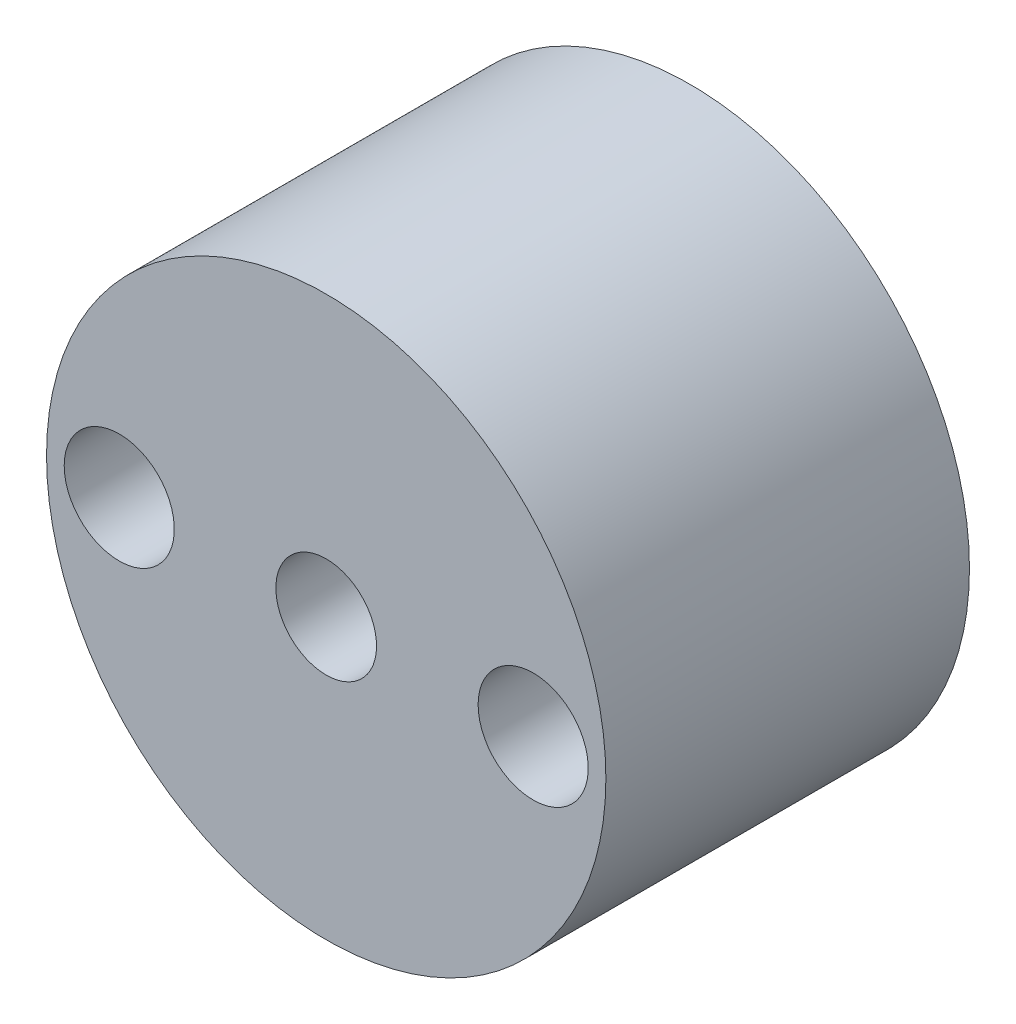
ISO-10303-21;
HEADER;
FILE_DESCRIPTION(('STEP AP214'),'2;1');
FILE_NAME('part.step','',(''),(''),'','','');
FILE_SCHEMA(('AUTOMOTIVE_DESIGN { 1 0 10303 214 1 1 1 1 }'));
ENDSEC;
DATA;
#1=APPLICATION_CONTEXT('core data for automotive mechanical design processes');
#2=APPLICATION_PROTOCOL_DEFINITION('international standard','automotive_design',2000,#1);
#3=PRODUCT_CONTEXT('',#1,'mechanical');
#4=PRODUCT('Part','Part','',(#3));
#5=PRODUCT_RELATED_PRODUCT_CATEGORY('part','',(#4));
#6=PRODUCT_DEFINITION_FORMATION('','',#4);
#7=PRODUCT_DEFINITION_CONTEXT('part definition',#1,'design');
#8=PRODUCT_DEFINITION('design','',#6,#7);
#9=PRODUCT_DEFINITION_SHAPE('','',#8);
#10=(LENGTH_UNIT() NAMED_UNIT(*) SI_UNIT(.MILLI.,.METRE.));
#11=(NAMED_UNIT(*) PLANE_ANGLE_UNIT() SI_UNIT($,.RADIAN.));
#12=(NAMED_UNIT(*) SI_UNIT($,.STERADIAN.) SOLID_ANGLE_UNIT());
#13=UNCERTAINTY_MEASURE_WITH_UNIT(LENGTH_MEASURE(1.E-05),#10,'distance_accuracy_value','');
#14=(GEOMETRIC_REPRESENTATION_CONTEXT(3) GLOBAL_UNCERTAINTY_ASSIGNED_CONTEXT((#13)) GLOBAL_UNIT_ASSIGNED_CONTEXT((#10,
#11,#12)) REPRESENTATION_CONTEXT('',''));
#15=CARTESIAN_POINT('',(0.,0.,0.));
#16=DIRECTION('',(0.,0.,1.));
#17=DIRECTION('',(1.,0.,0.));
#18=AXIS2_PLACEMENT_3D('',#15,#16,#17);
#19=CARTESIAN_POINT('',(0.,0.,0.));
#20=DIRECTION('',(0.,0.,1.));
#21=DIRECTION('',(1.,0.,0.));
#22=AXIS2_PLACEMENT_3D('',#19,#20,#21);
#23=PLANE('',#22);
#24=CARTESIAN_POINT('',(4.699,0.,0.));
#25=DIRECTION('',(0.,0.,-1.));
#26=DIRECTION('',(-1.,0.,0.));
#27=AXIS2_PLACEMENT_3D('',#24,#25,#26);
#28=CIRCLE('',#27,1.25);
#29=CARTESIAN_POINT('',(3.449,0.,0.));
#30=VERTEX_POINT('',#29);
#31=EDGE_CURVE('E132',#30,#30,#28,.T.);
#32=ORIENTED_EDGE('',*,*,#31,.F.);
#33=EDGE_LOOP('',(#32));
#34=FACE_BOUND('',#33,.T.);
#35=CARTESIAN_POINT('',(-4.699,0.,0.));
#36=DIRECTION('',(0.,0.,-1.));
#37=DIRECTION('',(-1.,0.,0.));
#38=AXIS2_PLACEMENT_3D('',#35,#36,#37);
#39=CIRCLE('',#38,1.25);
#40=CARTESIAN_POINT('',(-5.949,0.,0.));
#41=VERTEX_POINT('',#40);
#42=EDGE_CURVE('E126',#41,#41,#39,.T.);
#43=ORIENTED_EDGE('',*,*,#42,.F.);
#44=EDGE_LOOP('',(#43));
#45=FACE_BOUND('',#44,.T.);
#46=CARTESIAN_POINT('',(0.,0.,0.));
#47=DIRECTION('',(0.,0.,1.));
#48=DIRECTION('',(1.,0.,0.));
#49=AXIS2_PLACEMENT_3D('',#46,#47,#48);
#50=CIRCLE('',#49,6.35);
#51=CARTESIAN_POINT('',(6.35,0.,0.));
#52=VERTEX_POINT('',#51);
#53=EDGE_CURVE('E11',#52,#52,#50,.T.);
#54=ORIENTED_EDGE('',*,*,#53,.F.);
#55=EDGE_LOOP('',(#54));
#56=FACE_BOUND('',#55,.T.);
#57=CARTESIAN_POINT('',(0.,0.,0.));
#58=DIRECTION('',(0.,0.,1.));
#59=DIRECTION('',(-1.,0.,0.));
#60=AXIS2_PLACEMENT_3D('',#57,#58,#59);
#61=CIRCLE('',#60,3.50345101292997);
#62=CARTESIAN_POINT('',(2.413,2.54,0.));
#63=VERTEX_POINT('',#62);
#64=CARTESIAN_POINT('',(-2.413,2.54,0.));
#65=VERTEX_POINT('',#64);
#66=EDGE_CURVE('E48',#63,#65,#61,.T.);
#67=ORIENTED_EDGE('',*,*,#66,.T.);
#68=DIRECTION('',(0.,-1.,0.));
#69=VECTOR('',#68,1.);
#70=CARTESIAN_POINT('',(-2.413,-2.54,0.));
#71=LINE('',#70,#69);
#72=CARTESIAN_POINT('',(-2.413,-2.54,0.));
#73=VERTEX_POINT('',#72);
#74=EDGE_CURVE('E77',#65,#73,#71,.T.);
#75=ORIENTED_EDGE('',*,*,#74,.T.);
#76=CARTESIAN_POINT('',(0.,0.,0.));
#77=DIRECTION('',(0.,0.,1.));
#78=DIRECTION('',(1.,0.,0.));
#79=AXIS2_PLACEMENT_3D('',#76,#77,#78);
#80=CIRCLE('',#79,3.50345101292997);
#81=CARTESIAN_POINT('',(2.413,-2.54,0.));
#82=VERTEX_POINT('',#81);
#83=EDGE_CURVE('E85',#73,#82,#80,.T.);
#84=ORIENTED_EDGE('',*,*,#83,.T.);
#85=DIRECTION('',(0.,1.,0.));
#86=VECTOR('',#85,1.);
#87=CARTESIAN_POINT('',(2.413,-2.54,0.));
#88=LINE('',#87,#86);
#89=EDGE_CURVE('E91',#82,#63,#88,.T.);
#90=ORIENTED_EDGE('',*,*,#89,.T.);
#91=EDGE_LOOP('',(#67,#75,#84,#90));
#92=FACE_BOUND('',#91,.T.);
#93=ADVANCED_FACE('F33',(#34,#45,#56,#92),#23,.F.);
#94=CARTESIAN_POINT('',(0.,0.,5.08));
#95=DIRECTION('',(0.,0.,-1.));
#96=DIRECTION('',(-1.,0.,0.));
#97=AXIS2_PLACEMENT_3D('',#94,#95,#96);
#98=CYLINDRICAL_SURFACE('',#97,6.35);
#99=ORIENTED_EDGE('',*,*,#53,.T.);
#100=EDGE_LOOP('',(#99));
#101=FACE_BOUND('',#100,.T.);
#102=CARTESIAN_POINT('',(0.,0.,8.255));
#103=DIRECTION('',(0.,0.,1.));
#104=DIRECTION('',(1.,0.,0.));
#105=AXIS2_PLACEMENT_3D('',#102,#103,#104);
#106=CIRCLE('',#105,6.35);
#107=CARTESIAN_POINT('',(6.35,0.,8.255));
#108=VERTEX_POINT('',#107);
#109=EDGE_CURVE('E94',#108,#108,#106,.T.);
#110=ORIENTED_EDGE('',*,*,#109,.F.);
#111=EDGE_LOOP('',(#110));
#112=FACE_BOUND('',#111,.T.);
#113=ADVANCED_FACE('F35',(#101,#112),#98,.T.);
#114=CARTESIAN_POINT('',(0.,0.,5.08));
#115=DIRECTION('',(0.,0.,-1.));
#116=DIRECTION('',(-1.,0.,0.));
#117=AXIS2_PLACEMENT_3D('',#114,#115,#116);
#118=CYLINDRICAL_SURFACE('',#117,3.50345101292997);
#119=ORIENTED_EDGE('',*,*,#66,.F.);
#120=DIRECTION('',(0.,0.,-1.));
#121=VECTOR('',#120,1.);
#122=CARTESIAN_POINT('',(2.413,2.54,5.08));
#123=LINE('',#122,#121);
#124=CARTESIAN_POINT('',(2.413,2.54,5.08));
#125=VERTEX_POINT('',#124);
#126=EDGE_CURVE('E99',#125,#63,#123,.T.);
#127=ORIENTED_EDGE('',*,*,#126,.F.);
#128=CARTESIAN_POINT('',(0.,0.,5.08));
#129=DIRECTION('',(0.,0.,1.));
#130=DIRECTION('',(-1.,0.,0.));
#131=AXIS2_PLACEMENT_3D('',#128,#129,#130);
#132=CIRCLE('',#131,3.50345101292997);
#133=CARTESIAN_POINT('',(-2.413,2.54,5.08));
#134=VERTEX_POINT('',#133);
#135=EDGE_CURVE('E57',#125,#134,#132,.T.);
#136=ORIENTED_EDGE('',*,*,#135,.T.);
#137=DIRECTION('',(0.,0.,-1.));
#138=VECTOR('',#137,1.);
#139=CARTESIAN_POINT('',(-2.413,2.54,5.08));
#140=LINE('',#139,#138);
#141=EDGE_CURVE('E41',#134,#65,#140,.T.);
#142=ORIENTED_EDGE('',*,*,#141,.T.);
#143=EDGE_LOOP('',(#119,#127,#136,#142));
#144=FACE_BOUND('',#143,.T.);
#145=ADVANCED_FACE('F102',(#144),#118,.F.);
#146=CARTESIAN_POINT('',(-2.413,-2.54,5.08));
#147=DIRECTION('',(1.,0.,0.));
#148=DIRECTION('',(0.,1.,0.));
#149=AXIS2_PLACEMENT_3D('',#146,#147,#148);
#150=PLANE('',#149);
#151=ORIENTED_EDGE('',*,*,#74,.F.);
#152=ORIENTED_EDGE('',*,*,#141,.F.);
#153=DIRECTION('',(0.,-1.,0.));
#154=VECTOR('',#153,1.);
#155=CARTESIAN_POINT('',(-2.413,-2.54,5.08));
#156=LINE('',#155,#154);
#157=CARTESIAN_POINT('',(-2.413,-2.54,5.08));
#158=VERTEX_POINT('',#157);
#159=EDGE_CURVE('E79',#134,#158,#156,.T.);
#160=ORIENTED_EDGE('',*,*,#159,.T.);
#161=DIRECTION('',(0.,0.,-1.));
#162=VECTOR('',#161,1.);
#163=CARTESIAN_POINT('',(-2.413,-2.54,5.08));
#164=LINE('',#163,#162);
#165=EDGE_CURVE('E72',#158,#73,#164,.T.);
#166=ORIENTED_EDGE('',*,*,#165,.T.);
#167=EDGE_LOOP('',(#151,#152,#160,#166));
#168=FACE_BOUND('',#167,.T.);
#169=ADVANCED_FACE('F74',(#168),#150,.T.);
#170=CARTESIAN_POINT('',(0.,0.,5.08));
#171=DIRECTION('',(0.,0.,-1.));
#172=DIRECTION('',(-1.,0.,0.));
#173=AXIS2_PLACEMENT_3D('',#170,#171,#172);
#174=CYLINDRICAL_SURFACE('',#173,3.50345101292997);
#175=ORIENTED_EDGE('',*,*,#83,.F.);
#176=ORIENTED_EDGE('',*,*,#165,.F.);
#177=CARTESIAN_POINT('',(0.,0.,5.08));
#178=DIRECTION('',(0.,0.,1.));
#179=DIRECTION('',(1.,0.,0.));
#180=AXIS2_PLACEMENT_3D('',#177,#178,#179);
#181=CIRCLE('',#180,3.50345101292997);
#182=CARTESIAN_POINT('',(2.413,-2.54,5.08));
#183=VERTEX_POINT('',#182);
#184=EDGE_CURVE('E105',#158,#183,#181,.T.);
#185=ORIENTED_EDGE('',*,*,#184,.T.);
#186=DIRECTION('',(0.,0.,-1.));
#187=VECTOR('',#186,1.);
#188=CARTESIAN_POINT('',(2.413,-2.54,5.08));
#189=LINE('',#188,#187);
#190=EDGE_CURVE('E82',#183,#82,#189,.T.);
#191=ORIENTED_EDGE('',*,*,#190,.T.);
#192=EDGE_LOOP('',(#175,#176,#185,#191));
#193=FACE_BOUND('',#192,.T.);
#194=ADVANCED_FACE('F86',(#193),#174,.F.);
#195=CARTESIAN_POINT('',(2.413,-2.54,5.08));
#196=DIRECTION('',(-1.,0.,0.));
#197=DIRECTION('',(0.,-1.,0.));
#198=AXIS2_PLACEMENT_3D('',#195,#196,#197);
#199=PLANE('',#198);
#200=ORIENTED_EDGE('',*,*,#89,.F.);
#201=ORIENTED_EDGE('',*,*,#190,.F.);
#202=DIRECTION('',(0.,1.,0.));
#203=VECTOR('',#202,1.);
#204=CARTESIAN_POINT('',(2.413,-2.54,5.08));
#205=LINE('',#204,#203);
#206=EDGE_CURVE('E101',#183,#125,#205,.T.);
#207=ORIENTED_EDGE('',*,*,#206,.T.);
#208=ORIENTED_EDGE('',*,*,#126,.T.);
#209=EDGE_LOOP('',(#200,#201,#207,#208));
#210=FACE_BOUND('',#209,.T.);
#211=ADVANCED_FACE('F110',(#210),#199,.T.);
#212=CARTESIAN_POINT('',(0.,0.,8.255));
#213=DIRECTION('',(0.,0.,1.));
#214=DIRECTION('',(1.,0.,0.));
#215=AXIS2_PLACEMENT_3D('',#212,#213,#214);
#216=PLANE('',#215);
#217=CARTESIAN_POINT('',(4.699,0.,8.255));
#218=DIRECTION('',(0.,0.,-1.));
#219=DIRECTION('',(-1.,0.,0.));
#220=AXIS2_PLACEMENT_3D('',#217,#218,#219);
#221=CIRCLE('',#220,1.25);
#222=CARTESIAN_POINT('',(3.449,0.,8.255));
#223=VERTEX_POINT('',#222);
#224=EDGE_CURVE('E129',#223,#223,#221,.T.);
#225=ORIENTED_EDGE('',*,*,#224,.T.);
#226=EDGE_LOOP('',(#225));
#227=FACE_BOUND('',#226,.T.);
#228=CARTESIAN_POINT('',(-4.699,0.,8.255));
#229=DIRECTION('',(0.,0.,-1.));
#230=DIRECTION('',(-1.,0.,0.));
#231=AXIS2_PLACEMENT_3D('',#228,#229,#230);
#232=CIRCLE('',#231,1.25);
#233=CARTESIAN_POINT('',(-5.949,0.,8.255));
#234=VERTEX_POINT('',#233);
#235=EDGE_CURVE('E121',#234,#234,#232,.T.);
#236=ORIENTED_EDGE('',*,*,#235,.T.);
#237=EDGE_LOOP('',(#236));
#238=FACE_BOUND('',#237,.T.);
#239=ORIENTED_EDGE('',*,*,#109,.T.);
#240=EDGE_LOOP('',(#239));
#241=FACE_BOUND('',#240,.T.);
#242=CARTESIAN_POINT('',(0.,0.,8.255));
#243=DIRECTION('',(0.,0.,1.));
#244=DIRECTION('',(1.,0.,0.));
#245=AXIS2_PLACEMENT_3D('',#242,#243,#244);
#246=CIRCLE('',#245,1.143);
#247=CARTESIAN_POINT('',(1.143,0.,8.255));
#248=VERTEX_POINT('',#247);
#249=EDGE_CURVE('E117',#248,#248,#246,.T.);
#250=ORIENTED_EDGE('',*,*,#249,.F.);
#251=EDGE_LOOP('',(#250));
#252=FACE_BOUND('',#251,.T.);
#253=ADVANCED_FACE('F148',(#227,#238,#241,#252),#216,.T.);
#254=CARTESIAN_POINT('',(0.,0.,5.08));
#255=DIRECTION('',(0.,0.,1.));
#256=DIRECTION('',(1.,0.,0.));
#257=AXIS2_PLACEMENT_3D('',#254,#255,#256);
#258=PLANE('',#257);
#259=ORIENTED_EDGE('',*,*,#135,.F.);
#260=ORIENTED_EDGE('',*,*,#206,.F.);
#261=ORIENTED_EDGE('',*,*,#184,.F.);
#262=ORIENTED_EDGE('',*,*,#159,.F.);
#263=EDGE_LOOP('',(#259,#260,#261,#262));
#264=FACE_BOUND('',#263,.T.);
#265=CARTESIAN_POINT('',(0.,0.,5.08));
#266=DIRECTION('',(0.,0.,1.));
#267=DIRECTION('',(1.,0.,0.));
#268=AXIS2_PLACEMENT_3D('',#265,#266,#267);
#269=CIRCLE('',#268,1.143);
#270=CARTESIAN_POINT('',(1.143,0.,5.08));
#271=VERTEX_POINT('',#270);
#272=EDGE_CURVE('E118',#271,#271,#269,.T.);
#273=ORIENTED_EDGE('',*,*,#272,.T.);
#274=EDGE_LOOP('',(#273));
#275=FACE_BOUND('',#274,.T.);
#276=ADVANCED_FACE('F107',(#264,#275),#258,.F.);
#277=CARTESIAN_POINT('',(0.,0.,8.255));
#278=DIRECTION('',(0.,0.,-1.));
#279=DIRECTION('',(-1.,0.,0.));
#280=AXIS2_PLACEMENT_3D('',#277,#278,#279);
#281=CYLINDRICAL_SURFACE('',#280,1.143);
#282=ORIENTED_EDGE('',*,*,#249,.T.);
#283=EDGE_LOOP('',(#282));
#284=FACE_BOUND('',#283,.T.);
#285=ORIENTED_EDGE('',*,*,#272,.F.);
#286=EDGE_LOOP('',(#285));
#287=FACE_BOUND('',#286,.T.);
#288=ADVANCED_FACE('F155',(#284,#287),#281,.F.);
#289=CARTESIAN_POINT('',(-4.699,0.,0.));
#290=DIRECTION('',(0.,0.,-1.));
#291=DIRECTION('',(-1.,0.,0.));
#292=AXIS2_PLACEMENT_3D('',#289,#290,#291);
#293=CYLINDRICAL_SURFACE('',#292,1.25);
#294=ORIENTED_EDGE('',*,*,#235,.F.);
#295=EDGE_LOOP('',(#294));
#296=FACE_BOUND('',#295,.T.);
#297=ORIENTED_EDGE('',*,*,#42,.T.);
#298=EDGE_LOOP('',(#297));
#299=FACE_BOUND('',#298,.T.);
#300=ADVANCED_FACE('F158',(#296,#299),#293,.F.);
#301=CARTESIAN_POINT('',(4.699,0.,0.));
#302=DIRECTION('',(0.,0.,-1.));
#303=DIRECTION('',(-1.,0.,0.));
#304=AXIS2_PLACEMENT_3D('',#301,#302,#303);
#305=CYLINDRICAL_SURFACE('',#304,1.25);
#306=ORIENTED_EDGE('',*,*,#224,.F.);
#307=EDGE_LOOP('',(#306));
#308=FACE_BOUND('',#307,.T.);
#309=ORIENTED_EDGE('',*,*,#31,.T.);
#310=EDGE_LOOP('',(#309));
#311=FACE_BOUND('',#310,.T.);
#312=ADVANCED_FACE('F136',(#308,#311),#305,.F.);
#313=CLOSED_SHELL('',(#93,#113,#145,#169,#194,#211,#253,#276,#288,#300,#312));
#314=MANIFOLD_SOLID_BREP('B2',#313);
#315=ADVANCED_BREP_SHAPE_REPRESENTATION('',(#18,#314),#14);
#316=SHAPE_DEFINITION_REPRESENTATION(#9,#315);
ENDSEC;
END-ISO-10303-21;
